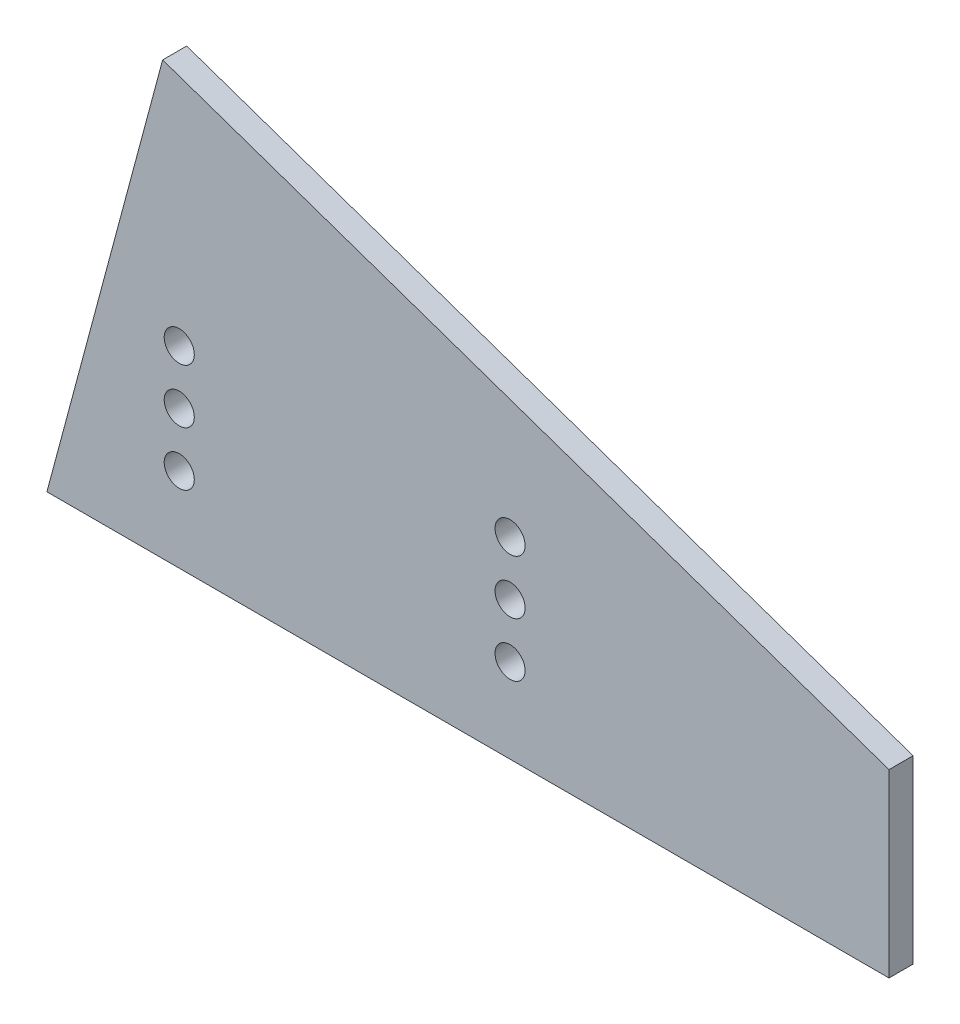
ISO-10303-21;
HEADER;
FILE_DESCRIPTION(('STEP AP214'),'2;1');
FILE_NAME('part.step','',(''),(''),'','','');
FILE_SCHEMA(('AUTOMOTIVE_DESIGN { 1 0 10303 214 1 1 1 1 }'));
ENDSEC;
DATA;
#1=APPLICATION_CONTEXT('core data for automotive mechanical design processes');
#2=APPLICATION_PROTOCOL_DEFINITION('international standard','automotive_design',2000,#1);
#3=PRODUCT_CONTEXT('',#1,'mechanical');
#4=PRODUCT('Part','Part','',(#3));
#5=PRODUCT_RELATED_PRODUCT_CATEGORY('part','',(#4));
#6=PRODUCT_DEFINITION_FORMATION('','',#4);
#7=PRODUCT_DEFINITION_CONTEXT('part definition',#1,'design');
#8=PRODUCT_DEFINITION('design','',#6,#7);
#9=PRODUCT_DEFINITION_SHAPE('','',#8);
#10=(LENGTH_UNIT() NAMED_UNIT(*) SI_UNIT(.MILLI.,.METRE.));
#11=(NAMED_UNIT(*) PLANE_ANGLE_UNIT() SI_UNIT($,.RADIAN.));
#12=(NAMED_UNIT(*) SI_UNIT($,.STERADIAN.) SOLID_ANGLE_UNIT());
#13=UNCERTAINTY_MEASURE_WITH_UNIT(LENGTH_MEASURE(1.E-05),#10,'distance_accuracy_value','');
#14=(GEOMETRIC_REPRESENTATION_CONTEXT(3) GLOBAL_UNCERTAINTY_ASSIGNED_CONTEXT((#13)) GLOBAL_UNIT_ASSIGNED_CONTEXT((#10,
#11,#12)) REPRESENTATION_CONTEXT('',''));
#15=CARTESIAN_POINT('',(0.,0.,0.));
#16=DIRECTION('',(0.,0.,1.));
#17=DIRECTION('',(1.,0.,0.));
#18=AXIS2_PLACEMENT_3D('',#15,#16,#17);
#19=CARTESIAN_POINT('',(-64.5783132530121,-40.,4.));
#20=DIRECTION('',(0.965925826289068,-0.258819045102521,0.));
#21=DIRECTION('',(0.258819045102521,0.965925826289068,0.));
#22=AXIS2_PLACEMENT_3D('',#19,#20,#21);
#23=PLANE('',#22);
#24=DIRECTION('',(-0.258819045102521,-0.965925826289068,0.));
#25=VECTOR('',#24,1.);
#26=CARTESIAN_POINT('',(-64.5783132530121,-40.,0.));
#27=LINE('',#26,#25);
#28=CARTESIAN_POINT('',(-45.3377866693096,31.8066227747573,0.));
#29=VERTEX_POINT('',#28);
#30=CARTESIAN_POINT('',(-64.5783132530121,-40.,0.));
#31=VERTEX_POINT('',#30);
#32=EDGE_CURVE('E106',#29,#31,#27,.T.);
#33=ORIENTED_EDGE('',*,*,#32,.T.);
#34=DIRECTION('',(0.,0.,-1.));
#35=VECTOR('',#34,1.);
#36=CARTESIAN_POINT('',(-64.5783132530121,-40.,4.));
#37=LINE('',#36,#35);
#38=CARTESIAN_POINT('',(-64.5783132530121,-40.,4.));
#39=VERTEX_POINT('',#38);
#40=EDGE_CURVE('E11',#39,#31,#37,.T.);
#41=ORIENTED_EDGE('',*,*,#40,.F.);
#42=DIRECTION('',(-0.258819045102521,-0.965925826289068,0.));
#43=VECTOR('',#42,1.);
#44=CARTESIAN_POINT('',(-64.5783132530121,-40.,4.));
#45=LINE('',#44,#43);
#46=CARTESIAN_POINT('',(-45.3377866693096,31.8066227747573,4.));
#47=VERTEX_POINT('',#46);
#48=EDGE_CURVE('E93',#47,#39,#45,.T.);
#49=ORIENTED_EDGE('',*,*,#48,.F.);
#50=DIRECTION('',(0.,0.,-1.));
#51=VECTOR('',#50,1.);
#52=CARTESIAN_POINT('',(-45.3377866693096,31.8066227747573,4.));
#53=LINE('',#52,#51);
#54=EDGE_CURVE('E102',#47,#29,#53,.T.);
#55=ORIENTED_EDGE('',*,*,#54,.T.);
#56=EDGE_LOOP('',(#33,#41,#49,#55));
#57=FACE_BOUND('',#56,.T.);
#58=ADVANCED_FACE('F40',(#57),#23,.F.);
#59=CARTESIAN_POINT('',(-64.5783132530121,-40.,4.));
#60=DIRECTION('',(0.,1.,0.));
#61=DIRECTION('',(0.,0.,1.));
#62=AXIS2_PLACEMENT_3D('',#59,#60,#61);
#63=PLANE('',#62);
#64=DIRECTION('',(1.,0.,0.));
#65=VECTOR('',#64,1.);
#66=CARTESIAN_POINT('',(-64.5783132530121,-40.,0.));
#67=LINE('',#66,#65);
#68=CARTESIAN_POINT('',(75.4216867469879,-40.,0.));
#69=VERTEX_POINT('',#68);
#70=EDGE_CURVE('E97',#31,#69,#67,.T.);
#71=ORIENTED_EDGE('',*,*,#70,.T.);
#72=DIRECTION('',(0.,0.,-1.));
#73=VECTOR('',#72,1.);
#74=CARTESIAN_POINT('',(75.4216867469879,-40.,4.));
#75=LINE('',#74,#73);
#76=CARTESIAN_POINT('',(75.4216867469879,-40.,4.));
#77=VERTEX_POINT('',#76);
#78=EDGE_CURVE('E49',#77,#69,#75,.T.);
#79=ORIENTED_EDGE('',*,*,#78,.F.);
#80=DIRECTION('',(1.,0.,0.));
#81=VECTOR('',#80,1.);
#82=CARTESIAN_POINT('',(-64.5783132530121,-40.,4.));
#83=LINE('',#82,#81);
#84=EDGE_CURVE('E88',#39,#77,#83,.T.);
#85=ORIENTED_EDGE('',*,*,#84,.F.);
#86=ORIENTED_EDGE('',*,*,#40,.T.);
#87=EDGE_LOOP('',(#71,#79,#85,#86));
#88=FACE_BOUND('',#87,.T.);
#89=ADVANCED_FACE('F96',(#88),#63,.F.);
#90=CARTESIAN_POINT('',(75.4216867469879,-40.,4.));
#91=DIRECTION('',(-1.,0.,0.));
#92=DIRECTION('',(0.,0.,1.));
#93=AXIS2_PLACEMENT_3D('',#90,#91,#92);
#94=PLANE('',#93);
#95=DIRECTION('',(0.,1.,0.));
#96=VECTOR('',#95,1.);
#97=CARTESIAN_POINT('',(75.4216867469879,-40.,0.));
#98=LINE('',#97,#96);
#99=CARTESIAN_POINT('',(75.4216867469879,-10.,0.));
#100=VERTEX_POINT('',#99);
#101=EDGE_CURVE('E75',#69,#100,#98,.T.);
#102=ORIENTED_EDGE('',*,*,#101,.T.);
#103=DIRECTION('',(0.,0.,-1.));
#104=VECTOR('',#103,1.);
#105=CARTESIAN_POINT('',(75.4216867469879,-10.,4.));
#106=LINE('',#105,#104);
#107=CARTESIAN_POINT('',(75.4216867469879,-10.,4.));
#108=VERTEX_POINT('',#107);
#109=EDGE_CURVE('E98',#108,#100,#106,.T.);
#110=ORIENTED_EDGE('',*,*,#109,.F.);
#111=DIRECTION('',(0.,1.,0.));
#112=VECTOR('',#111,1.);
#113=CARTESIAN_POINT('',(75.4216867469879,-40.,4.));
#114=LINE('',#113,#112);
#115=EDGE_CURVE('E91',#77,#108,#114,.T.);
#116=ORIENTED_EDGE('',*,*,#115,.F.);
#117=ORIENTED_EDGE('',*,*,#78,.T.);
#118=EDGE_LOOP('',(#102,#110,#116,#117));
#119=FACE_BOUND('',#118,.T.);
#120=ADVANCED_FACE('F100',(#119),#94,.F.);
#121=CARTESIAN_POINT('',(75.4216867469879,-10.,4.));
#122=DIRECTION('',(-0.327147366264635,-0.944973333351853,0.));
#123=DIRECTION('',(0.944973333351853,-0.327147366264635,0.));
#124=AXIS2_PLACEMENT_3D('',#121,#122,#123);
#125=PLANE('',#124);
#126=DIRECTION('',(-0.944973333351853,0.327147366264635,0.));
#127=VECTOR('',#126,1.);
#128=CARTESIAN_POINT('',(75.4216867469879,-10.,0.));
#129=LINE('',#128,#127);
#130=EDGE_CURVE('E81',#100,#29,#129,.T.);
#131=ORIENTED_EDGE('',*,*,#130,.T.);
#132=ORIENTED_EDGE('',*,*,#54,.F.);
#133=DIRECTION('',(-0.944973333351853,0.327147366264635,0.));
#134=VECTOR('',#133,1.);
#135=CARTESIAN_POINT('',(75.4216867469879,-10.,4.));
#136=LINE('',#135,#134);
#137=EDGE_CURVE('E58',#108,#47,#136,.T.);
#138=ORIENTED_EDGE('',*,*,#137,.F.);
#139=ORIENTED_EDGE('',*,*,#109,.T.);
#140=EDGE_LOOP('',(#131,#132,#138,#139));
#141=FACE_BOUND('',#140,.T.);
#142=ADVANCED_FACE('F165',(#141),#125,.F.);
#143=CARTESIAN_POINT('',(0.,0.,4.));
#144=DIRECTION('',(0.,0.,1.));
#145=DIRECTION('',(1.,0.,0.));
#146=AXIS2_PLACEMENT_3D('',#143,#144,#145);
#147=PLANE('',#146);
#148=CARTESIAN_POINT('',(12.4216867469879,-8.,4.));
#149=DIRECTION('',(0.,0.,1.));
#150=DIRECTION('',(1.,0.,0.));
#151=AXIS2_PLACEMENT_3D('',#148,#149,#150);
#152=CIRCLE('',#151,2.5);
#153=CARTESIAN_POINT('',(14.9216867469879,-8.,4.));
#154=VERTEX_POINT('',#153);
#155=EDGE_CURVE('E257',#154,#154,#152,.T.);
#156=ORIENTED_EDGE('',*,*,#155,.F.);
#157=EDGE_LOOP('',(#156));
#158=FACE_BOUND('',#157,.T.);
#159=CARTESIAN_POINT('',(-42.5783132530121,-26.,4.));
#160=DIRECTION('',(0.,0.,1.));
#161=DIRECTION('',(1.,0.,0.));
#162=AXIS2_PLACEMENT_3D('',#159,#160,#161);
#163=CIRCLE('',#162,2.5);
#164=CARTESIAN_POINT('',(-40.0783132530121,-26.,4.));
#165=VERTEX_POINT('',#164);
#166=EDGE_CURVE('E252',#165,#165,#163,.T.);
#167=ORIENTED_EDGE('',*,*,#166,.F.);
#168=EDGE_LOOP('',(#167));
#169=FACE_BOUND('',#168,.T.);
#170=CARTESIAN_POINT('',(-42.5783132530121,-8.,4.));
#171=DIRECTION('',(0.,0.,1.));
#172=DIRECTION('',(1.,0.,0.));
#173=AXIS2_PLACEMENT_3D('',#170,#171,#172);
#174=CIRCLE('',#173,2.5);
#175=CARTESIAN_POINT('',(-40.0783132530121,-8.,4.));
#176=VERTEX_POINT('',#175);
#177=EDGE_CURVE('E238',#176,#176,#174,.T.);
#178=ORIENTED_EDGE('',*,*,#177,.F.);
#179=EDGE_LOOP('',(#178));
#180=FACE_BOUND('',#179,.T.);
#181=CARTESIAN_POINT('',(-42.5783132530121,-17.,4.));
#182=DIRECTION('',(0.,0.,1.));
#183=DIRECTION('',(1.,0.,0.));
#184=AXIS2_PLACEMENT_3D('',#181,#182,#183);
#185=CIRCLE('',#184,2.5);
#186=CARTESIAN_POINT('',(-40.0783132530121,-17.,4.));
#187=VERTEX_POINT('',#186);
#188=EDGE_CURVE('E251',#187,#187,#185,.T.);
#189=ORIENTED_EDGE('',*,*,#188,.F.);
#190=EDGE_LOOP('',(#189));
#191=FACE_BOUND('',#190,.T.);
#192=CARTESIAN_POINT('',(12.4216867469879,-26.,4.));
#193=DIRECTION('',(0.,0.,1.));
#194=DIRECTION('',(1.,0.,0.));
#195=AXIS2_PLACEMENT_3D('',#192,#193,#194);
#196=CIRCLE('',#195,2.5);
#197=CARTESIAN_POINT('',(14.9216867469879,-26.,4.));
#198=VERTEX_POINT('',#197);
#199=EDGE_CURVE('E264',#198,#198,#196,.T.);
#200=ORIENTED_EDGE('',*,*,#199,.F.);
#201=EDGE_LOOP('',(#200));
#202=FACE_BOUND('',#201,.T.);
#203=CARTESIAN_POINT('',(12.4216867469879,-17.,4.));
#204=DIRECTION('',(0.,0.,1.));
#205=DIRECTION('',(1.,0.,0.));
#206=AXIS2_PLACEMENT_3D('',#203,#204,#205);
#207=CIRCLE('',#206,2.5);
#208=CARTESIAN_POINT('',(14.9216867469879,-17.,4.));
#209=VERTEX_POINT('',#208);
#210=EDGE_CURVE('E118',#209,#209,#207,.T.);
#211=ORIENTED_EDGE('',*,*,#210,.F.);
#212=EDGE_LOOP('',(#211));
#213=FACE_BOUND('',#212,.T.);
#214=ORIENTED_EDGE('',*,*,#48,.T.);
#215=ORIENTED_EDGE('',*,*,#84,.T.);
#216=ORIENTED_EDGE('',*,*,#115,.T.);
#217=ORIENTED_EDGE('',*,*,#137,.T.);
#218=EDGE_LOOP('',(#214,#215,#216,#217));
#219=FACE_BOUND('',#218,.T.);
#220=ADVANCED_FACE('F89',(#158,#169,#180,#191,#202,#213,#219),#147,.T.);
#221=CARTESIAN_POINT('',(0.,0.,0.));
#222=DIRECTION('',(0.,0.,1.));
#223=DIRECTION('',(1.,0.,0.));
#224=AXIS2_PLACEMENT_3D('',#221,#222,#223);
#225=PLANE('',#224);
#226=CARTESIAN_POINT('',(12.4216867469879,-8.,0.));
#227=DIRECTION('',(0.,0.,1.));
#228=DIRECTION('',(1.,0.,0.));
#229=AXIS2_PLACEMENT_3D('',#226,#227,#228);
#230=CIRCLE('',#229,2.5);
#231=CARTESIAN_POINT('',(14.9216867469879,-8.,0.));
#232=VERTEX_POINT('',#231);
#233=EDGE_CURVE('E43',#232,#232,#230,.T.);
#234=ORIENTED_EDGE('',*,*,#233,.T.);
#235=EDGE_LOOP('',(#234));
#236=FACE_BOUND('',#235,.T.);
#237=CARTESIAN_POINT('',(-42.5783132530121,-26.,0.));
#238=DIRECTION('',(0.,0.,1.));
#239=DIRECTION('',(1.,0.,0.));
#240=AXIS2_PLACEMENT_3D('',#237,#238,#239);
#241=CIRCLE('',#240,2.5);
#242=CARTESIAN_POINT('',(-40.0783132530121,-26.,0.));
#243=VERTEX_POINT('',#242);
#244=EDGE_CURVE('E126',#243,#243,#241,.T.);
#245=ORIENTED_EDGE('',*,*,#244,.T.);
#246=EDGE_LOOP('',(#245));
#247=FACE_BOUND('',#246,.T.);
#248=CARTESIAN_POINT('',(-42.5783132530121,-8.,0.));
#249=DIRECTION('',(0.,0.,1.));
#250=DIRECTION('',(1.,0.,0.));
#251=AXIS2_PLACEMENT_3D('',#248,#249,#250);
#252=CIRCLE('',#251,2.5);
#253=CARTESIAN_POINT('',(-40.0783132530121,-8.,0.));
#254=VERTEX_POINT('',#253);
#255=EDGE_CURVE('E124',#254,#254,#252,.T.);
#256=ORIENTED_EDGE('',*,*,#255,.T.);
#257=EDGE_LOOP('',(#256));
#258=FACE_BOUND('',#257,.T.);
#259=CARTESIAN_POINT('',(-42.5783132530121,-17.,0.));
#260=DIRECTION('',(0.,0.,1.));
#261=DIRECTION('',(1.,0.,0.));
#262=AXIS2_PLACEMENT_3D('',#259,#260,#261);
#263=CIRCLE('',#262,2.5);
#264=CARTESIAN_POINT('',(-40.0783132530121,-17.,0.));
#265=VERTEX_POINT('',#264);
#266=EDGE_CURVE('E121',#265,#265,#263,.T.);
#267=ORIENTED_EDGE('',*,*,#266,.T.);
#268=EDGE_LOOP('',(#267));
#269=FACE_BOUND('',#268,.T.);
#270=CARTESIAN_POINT('',(12.4216867469879,-26.,0.));
#271=DIRECTION('',(0.,0.,1.));
#272=DIRECTION('',(1.,0.,0.));
#273=AXIS2_PLACEMENT_3D('',#270,#271,#272);
#274=CIRCLE('',#273,2.5);
#275=CARTESIAN_POINT('',(14.9216867469879,-26.,0.));
#276=VERTEX_POINT('',#275);
#277=EDGE_CURVE('E117',#276,#276,#274,.T.);
#278=ORIENTED_EDGE('',*,*,#277,.T.);
#279=EDGE_LOOP('',(#278));
#280=FACE_BOUND('',#279,.T.);
#281=CARTESIAN_POINT('',(12.4216867469879,-17.,0.));
#282=DIRECTION('',(0.,0.,1.));
#283=DIRECTION('',(1.,0.,0.));
#284=AXIS2_PLACEMENT_3D('',#281,#282,#283);
#285=CIRCLE('',#284,2.5);
#286=CARTESIAN_POINT('',(14.9216867469879,-17.,0.));
#287=VERTEX_POINT('',#286);
#288=EDGE_CURVE('E114',#287,#287,#285,.T.);
#289=ORIENTED_EDGE('',*,*,#288,.T.);
#290=EDGE_LOOP('',(#289));
#291=FACE_BOUND('',#290,.T.);
#292=ORIENTED_EDGE('',*,*,#32,.F.);
#293=ORIENTED_EDGE('',*,*,#130,.F.);
#294=ORIENTED_EDGE('',*,*,#101,.F.);
#295=ORIENTED_EDGE('',*,*,#70,.F.);
#296=EDGE_LOOP('',(#292,#293,#294,#295));
#297=FACE_BOUND('',#296,.T.);
#298=ADVANCED_FACE('F133',(#236,#247,#258,#269,#280,#291,#297),#225,.F.);
#299=CARTESIAN_POINT('',(12.4216867469879,-17.,-6.));
#300=DIRECTION('',(0.,0.,1.));
#301=DIRECTION('',(1.,0.,0.));
#302=AXIS2_PLACEMENT_3D('',#299,#300,#301);
#303=CYLINDRICAL_SURFACE('',#302,2.5);
#304=ORIENTED_EDGE('',*,*,#210,.T.);
#305=EDGE_LOOP('',(#304));
#306=FACE_BOUND('',#305,.T.);
#307=ORIENTED_EDGE('',*,*,#288,.F.);
#308=EDGE_LOOP('',(#307));
#309=FACE_BOUND('',#308,.T.);
#310=ADVANCED_FACE('F156',(#306,#309),#303,.F.);
#311=CARTESIAN_POINT('',(12.4216867469879,-26.,-6.));
#312=DIRECTION('',(0.,0.,1.));
#313=DIRECTION('',(1.,0.,0.));
#314=AXIS2_PLACEMENT_3D('',#311,#312,#313);
#315=CYLINDRICAL_SURFACE('',#314,2.5);
#316=ORIENTED_EDGE('',*,*,#199,.T.);
#317=EDGE_LOOP('',(#316));
#318=FACE_BOUND('',#317,.T.);
#319=ORIENTED_EDGE('',*,*,#277,.F.);
#320=EDGE_LOOP('',(#319));
#321=FACE_BOUND('',#320,.T.);
#322=ADVANCED_FACE('F162',(#318,#321),#315,.F.);
#323=CARTESIAN_POINT('',(-42.5783132530121,-17.,-6.));
#324=DIRECTION('',(0.,0.,1.));
#325=DIRECTION('',(1.,0.,0.));
#326=AXIS2_PLACEMENT_3D('',#323,#324,#325);
#327=CYLINDRICAL_SURFACE('',#326,2.5);
#328=ORIENTED_EDGE('',*,*,#188,.T.);
#329=EDGE_LOOP('',(#328));
#330=FACE_BOUND('',#329,.T.);
#331=ORIENTED_EDGE('',*,*,#266,.F.);
#332=EDGE_LOOP('',(#331));
#333=FACE_BOUND('',#332,.T.);
#334=ADVANCED_FACE('F203',(#330,#333),#327,.F.);
#335=CARTESIAN_POINT('',(-42.5783132530121,-8.,-6.));
#336=DIRECTION('',(0.,0.,1.));
#337=DIRECTION('',(1.,0.,0.));
#338=AXIS2_PLACEMENT_3D('',#335,#336,#337);
#339=CYLINDRICAL_SURFACE('',#338,2.5);
#340=ORIENTED_EDGE('',*,*,#177,.T.);
#341=EDGE_LOOP('',(#340));
#342=FACE_BOUND('',#341,.T.);
#343=ORIENTED_EDGE('',*,*,#255,.F.);
#344=EDGE_LOOP('',(#343));
#345=FACE_BOUND('',#344,.T.);
#346=ADVANCED_FACE('F143',(#342,#345),#339,.F.);
#347=CARTESIAN_POINT('',(-42.5783132530121,-26.,-6.));
#348=DIRECTION('',(0.,0.,1.));
#349=DIRECTION('',(1.,0.,0.));
#350=AXIS2_PLACEMENT_3D('',#347,#348,#349);
#351=CYLINDRICAL_SURFACE('',#350,2.5);
#352=ORIENTED_EDGE('',*,*,#166,.T.);
#353=EDGE_LOOP('',(#352));
#354=FACE_BOUND('',#353,.T.);
#355=ORIENTED_EDGE('',*,*,#244,.F.);
#356=EDGE_LOOP('',(#355));
#357=FACE_BOUND('',#356,.T.);
#358=ADVANCED_FACE('F137',(#354,#357),#351,.F.);
#359=CARTESIAN_POINT('',(12.4216867469879,-8.,-6.));
#360=DIRECTION('',(0.,0.,1.));
#361=DIRECTION('',(1.,0.,0.));
#362=AXIS2_PLACEMENT_3D('',#359,#360,#361);
#363=CYLINDRICAL_SURFACE('',#362,2.5);
#364=ORIENTED_EDGE('',*,*,#155,.T.);
#365=EDGE_LOOP('',(#364));
#366=FACE_BOUND('',#365,.T.);
#367=ORIENTED_EDGE('',*,*,#233,.F.);
#368=EDGE_LOOP('',(#367));
#369=FACE_BOUND('',#368,.T.);
#370=ADVANCED_FACE('F135',(#366,#369),#363,.F.);
#371=CLOSED_SHELL('',(#58,#89,#120,#142,#220,#298,#310,#322,#334,#346,#358,#370));
#372=MANIFOLD_SOLID_BREP('B2',#371);
#373=ADVANCED_BREP_SHAPE_REPRESENTATION('',(#18,#372),#14);
#374=SHAPE_DEFINITION_REPRESENTATION(#9,#373);
ENDSEC;
END-ISO-10303-21;
